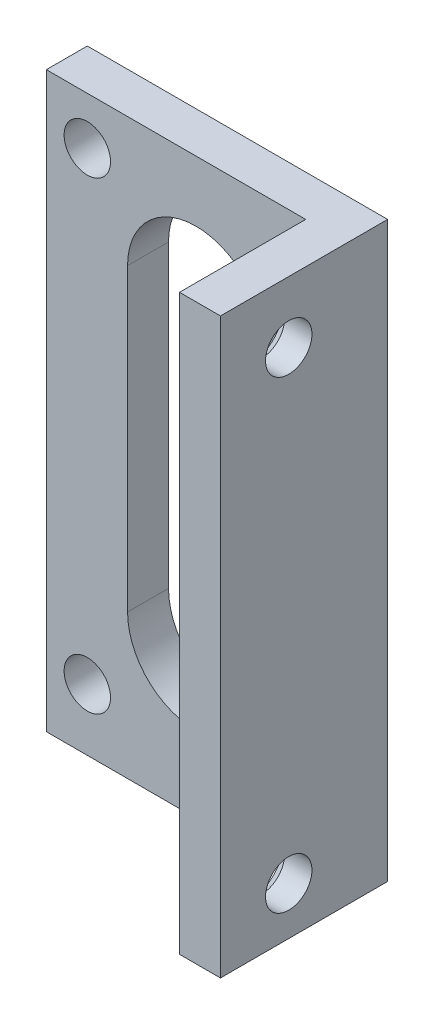
ISO-10303-21;
HEADER;
FILE_DESCRIPTION(('STEP AP214'),'2;1');
FILE_NAME('part.step','',(''),(''),'','','');
FILE_SCHEMA(('AUTOMOTIVE_DESIGN { 1 0 10303 214 1 1 1 1 }'));
ENDSEC;
DATA;
#1=APPLICATION_CONTEXT('core data for automotive mechanical design processes');
#2=APPLICATION_PROTOCOL_DEFINITION('international standard','automotive_design',2000,#1);
#3=PRODUCT_CONTEXT('',#1,'mechanical');
#4=PRODUCT('Part','Part','',(#3));
#5=PRODUCT_RELATED_PRODUCT_CATEGORY('part','',(#4));
#6=PRODUCT_DEFINITION_FORMATION('','',#4);
#7=PRODUCT_DEFINITION_CONTEXT('part definition',#1,'design');
#8=PRODUCT_DEFINITION('design','',#6,#7);
#9=PRODUCT_DEFINITION_SHAPE('','',#8);
#10=(LENGTH_UNIT() NAMED_UNIT(*) SI_UNIT(.MILLI.,.METRE.));
#11=(NAMED_UNIT(*) PLANE_ANGLE_UNIT() SI_UNIT($,.RADIAN.));
#12=(NAMED_UNIT(*) SI_UNIT($,.STERADIAN.) SOLID_ANGLE_UNIT());
#13=UNCERTAINTY_MEASURE_WITH_UNIT(LENGTH_MEASURE(1.E-05),#10,'distance_accuracy_value','');
#14=(GEOMETRIC_REPRESENTATION_CONTEXT(3) GLOBAL_UNCERTAINTY_ASSIGNED_CONTEXT((#13)) GLOBAL_UNIT_ASSIGNED_CONTEXT((#10,
#11,#12)) REPRESENTATION_CONTEXT('',''));
#15=CARTESIAN_POINT('',(0.,0.,0.));
#16=DIRECTION('',(0.,0.,1.));
#17=DIRECTION('',(1.,0.,0.));
#18=AXIS2_PLACEMENT_3D('',#15,#16,#17);
#19=CARTESIAN_POINT('',(0.,0.,0.));
#20=DIRECTION('',(1.,0.,0.));
#21=DIRECTION('',(0.,0.,-1.));
#22=AXIS2_PLACEMENT_3D('',#19,#20,#21);
#23=PLANE('',#22);
#24=CARTESIAN_POINT('',(0.,0.,0.));
#25=DIRECTION('',(1.,0.,0.));
#26=DIRECTION('',(0.,0.,-1.));
#27=AXIS2_PLACEMENT_3D('',#24,#25,#26);
#28=CIRCLE('',#27,2.70000000000001);
#29=CARTESIAN_POINT('',(0.,0.,-2.70000000000001));
#30=VERTEX_POINT('',#29);
#31=EDGE_CURVE('E213',#30,#30,#28,.T.);
#32=ORIENTED_EDGE('',*,*,#31,.T.);
#33=EDGE_LOOP('',(#32));
#34=FACE_BOUND('',#33,.T.);
#35=CARTESIAN_POINT('',(0.,34.,0.));
#36=DIRECTION('',(1.,0.,0.));
#37=DIRECTION('',(0.,0.,-1.));
#38=AXIS2_PLACEMENT_3D('',#35,#36,#37);
#39=CIRCLE('',#38,2.70000000000001);
#40=CARTESIAN_POINT('',(0.,34.,-2.70000000000001));
#41=VERTEX_POINT('',#40);
#42=EDGE_CURVE('E210',#41,#41,#39,.T.);
#43=ORIENTED_EDGE('',*,*,#42,.T.);
#44=EDGE_LOOP('',(#43));
#45=FACE_BOUND('',#44,.T.);
#46=DIRECTION('',(0.,1.,0.));
#47=VECTOR('',#46,1.);
#48=CARTESIAN_POINT('',(0.,38.5,-4.24665680886895));
#49=LINE('',#48,#47);
#50=CARTESIAN_POINT('',(0.,-3.5,-4.24665680886895));
#51=VERTEX_POINT('',#50);
#52=CARTESIAN_POINT('',(0.,38.5,-4.24665680886895));
#53=VERTEX_POINT('',#52);
#54=EDGE_CURVE('E159',#51,#53,#49,.T.);
#55=ORIENTED_EDGE('',*,*,#54,.F.);
#56=DIRECTION('',(0.,0.,-1.));
#57=VECTOR('',#56,1.);
#58=CARTESIAN_POINT('',(0.,-3.5,0.));
#59=LINE('',#58,#57);
#60=CARTESIAN_POINT('',(0.,-3.5,4.99999999999999));
#61=VERTEX_POINT('',#60);
#62=EDGE_CURVE('E178',#61,#51,#59,.T.);
#63=ORIENTED_EDGE('',*,*,#62,.F.);
#64=DIRECTION('',(0.,-1.,0.));
#65=VECTOR('',#64,1.);
#66=CARTESIAN_POINT('',(0.,0.,5.));
#67=LINE('',#66,#65);
#68=CARTESIAN_POINT('',(0.,38.5,5.));
#69=VERTEX_POINT('',#68);
#70=EDGE_CURVE('E183',#69,#61,#67,.T.);
#71=ORIENTED_EDGE('',*,*,#70,.F.);
#72=DIRECTION('',(0.,0.,1.));
#73=VECTOR('',#72,1.);
#74=CARTESIAN_POINT('',(0.,38.5,0.));
#75=LINE('',#74,#73);
#76=EDGE_CURVE('E198',#53,#69,#75,.T.);
#77=ORIENTED_EDGE('',*,*,#76,.F.);
#78=EDGE_LOOP('',(#55,#63,#71,#77));
#79=FACE_BOUND('',#78,.T.);
#80=ADVANCED_FACE('F35',(#34,#45,#79),#23,.F.);
#81=CARTESIAN_POINT('',(3.,-3.5,0.));
#82=DIRECTION('',(0.,1.,0.));
#83=DIRECTION('',(0.,0.,1.));
#84=AXIS2_PLACEMENT_3D('',#81,#82,#83);
#85=PLANE('',#84);
#86=ORIENTED_EDGE('',*,*,#62,.T.);
#87=DIRECTION('',(1.,0.,0.));
#88=VECTOR('',#87,1.);
#89=CARTESIAN_POINT('',(-19.,-3.5,-4.24665680886895));
#90=LINE('',#89,#88);
#91=CARTESIAN_POINT('',(-19.,-3.5,-4.24665680886895));
#92=VERTEX_POINT('',#91);
#93=EDGE_CURVE('E175',#92,#51,#90,.T.);
#94=ORIENTED_EDGE('',*,*,#93,.F.);
#95=DIRECTION('',(0.,0.,1.));
#96=VECTOR('',#95,1.);
#97=CARTESIAN_POINT('',(-19.,-3.5,-4.24665680886895));
#98=LINE('',#97,#96);
#99=CARTESIAN_POINT('',(-19.,-3.5,-7.24665680886895));
#100=VERTEX_POINT('',#99);
#101=EDGE_CURVE('E163',#100,#92,#98,.T.);
#102=ORIENTED_EDGE('',*,*,#101,.F.);
#103=DIRECTION('',(-1.,0.,0.));
#104=VECTOR('',#103,1.);
#105=CARTESIAN_POINT('',(3.,-3.5,-7.24665680886895));
#106=LINE('',#105,#104);
#107=CARTESIAN_POINT('',(3.,-3.5,-7.24665680886895));
#108=VERTEX_POINT('',#107);
#109=EDGE_CURVE('E208',#108,#100,#106,.T.);
#110=ORIENTED_EDGE('',*,*,#109,.F.);
#111=DIRECTION('',(0.,0.,-1.));
#112=VECTOR('',#111,1.);
#113=CARTESIAN_POINT('',(3.,-3.5,0.));
#114=LINE('',#113,#112);
#115=CARTESIAN_POINT('',(3.,-3.5,4.99999999999999));
#116=VERTEX_POINT('',#115);
#117=EDGE_CURVE('E182',#116,#108,#114,.T.);
#118=ORIENTED_EDGE('',*,*,#117,.F.);
#119=DIRECTION('',(-1.,0.,0.));
#120=VECTOR('',#119,1.);
#121=CARTESIAN_POINT('',(3.,-3.5,4.99999999999999));
#122=LINE('',#121,#120);
#123=EDGE_CURVE('E195',#116,#61,#122,.T.);
#124=ORIENTED_EDGE('',*,*,#123,.T.);
#125=EDGE_LOOP('',(#86,#94,#102,#110,#118,#124));
#126=FACE_BOUND('',#125,.T.);
#127=ADVANCED_FACE('F228',(#126),#85,.F.);
#128=CARTESIAN_POINT('',(3.,0.,-7.24665680886895));
#129=DIRECTION('',(0.,0.,-1.));
#130=DIRECTION('',(-1.,0.,0.));
#131=AXIS2_PLACEMENT_3D('',#128,#129,#130);
#132=PLANE('',#131);
#133=CARTESIAN_POINT('',(-8.04107401767495,29.0412137218457,-7.24665680886895));
#134=DIRECTION('',(0.,0.,-1.));
#135=DIRECTION('',(-1.,0.,0.));
#136=AXIS2_PLACEMENT_3D('',#133,#134,#135);
#137=CIRCLE('',#136,5.01011206358471);
#138=CARTESIAN_POINT('',(-13.0511860812597,29.0412137218457,-7.24665680886895));
#139=VERTEX_POINT('',#138);
#140=CARTESIAN_POINT('',(-3.03096195409024,29.0412137218457,-7.24665680886895));
#141=VERTEX_POINT('',#140);
#142=EDGE_CURVE('E145',#139,#141,#137,.T.);
#143=ORIENTED_EDGE('',*,*,#142,.F.);
#144=DIRECTION('',(0.,1.,0.));
#145=VECTOR('',#144,1.);
#146=CARTESIAN_POINT('',(-13.0511860812597,0.,-7.24665680886895));
#147=LINE('',#146,#145);
#148=CARTESIAN_POINT('',(-13.0511860812597,7.06663976611031,-7.24665680886895));
#149=VERTEX_POINT('',#148);
#150=EDGE_CURVE('E138',#149,#139,#147,.T.);
#151=ORIENTED_EDGE('',*,*,#150,.F.);
#152=CARTESIAN_POINT('',(-8.04107401767495,7.06663976611031,-7.24665680886895));
#153=DIRECTION('',(0.,0.,-1.));
#154=DIRECTION('',(-1.,0.,0.));
#155=AXIS2_PLACEMENT_3D('',#152,#153,#154);
#156=CIRCLE('',#155,5.01011206358471);
#157=CARTESIAN_POINT('',(-3.03096195409024,7.06663976611031,-7.24665680886895));
#158=VERTEX_POINT('',#157);
#159=EDGE_CURVE('E118',#158,#149,#156,.T.);
#160=ORIENTED_EDGE('',*,*,#159,.F.);
#161=DIRECTION('',(0.,-1.,0.));
#162=VECTOR('',#161,1.);
#163=CARTESIAN_POINT('',(-3.03096195409024,0.,-7.24665680886895));
#164=LINE('',#163,#162);
#165=EDGE_CURVE('E143',#141,#158,#164,.T.);
#166=ORIENTED_EDGE('',*,*,#165,.F.);
#167=EDGE_LOOP('',(#143,#151,#160,#166));
#168=FACE_BOUND('',#167,.T.);
#169=CARTESIAN_POINT('',(-16.,35.0103787056936,-7.24665680886895));
#170=DIRECTION('',(0.,0.,-1.));
#171=DIRECTION('',(-1.,0.,0.));
#172=AXIS2_PLACEMENT_3D('',#169,#170,#171);
#173=CIRCLE('',#172,1.7);
#174=CARTESIAN_POINT('',(-17.7,35.0103787056936,-7.24665680886895));
#175=VERTEX_POINT('',#174);
#176=EDGE_CURVE('E150',#175,#175,#173,.T.);
#177=ORIENTED_EDGE('',*,*,#176,.F.);
#178=EDGE_LOOP('',(#177));
#179=FACE_BOUND('',#178,.T.);
#180=CARTESIAN_POINT('',(-16.,1.0103787056936,-7.24665680886895));
#181=DIRECTION('',(0.,0.,-1.));
#182=DIRECTION('',(-1.,0.,0.));
#183=AXIS2_PLACEMENT_3D('',#180,#181,#182);
#184=CIRCLE('',#183,1.7);
#185=CARTESIAN_POINT('',(-17.7,1.0103787056936,-7.24665680886895));
#186=VERTEX_POINT('',#185);
#187=EDGE_CURVE('E156',#186,#186,#184,.T.);
#188=ORIENTED_EDGE('',*,*,#187,.F.);
#189=EDGE_LOOP('',(#188));
#190=FACE_BOUND('',#189,.T.);
#191=ORIENTED_EDGE('',*,*,#109,.T.);
#192=DIRECTION('',(0.,-1.,0.));
#193=VECTOR('',#192,1.);
#194=CARTESIAN_POINT('',(-19.,-3.5,-7.24665680886895));
#195=LINE('',#194,#193);
#196=CARTESIAN_POINT('',(-19.,38.5,-7.24665680886895));
#197=VERTEX_POINT('',#196);
#198=EDGE_CURVE('E160',#197,#100,#195,.T.);
#199=ORIENTED_EDGE('',*,*,#198,.F.);
#200=DIRECTION('',(-1.,0.,0.));
#201=VECTOR('',#200,1.);
#202=CARTESIAN_POINT('',(3.,38.5,-7.24665680886895));
#203=LINE('',#202,#201);
#204=CARTESIAN_POINT('',(3.,38.5,-7.24665680886895));
#205=VERTEX_POINT('',#204);
#206=EDGE_CURVE('E206',#205,#197,#203,.T.);
#207=ORIENTED_EDGE('',*,*,#206,.F.);
#208=DIRECTION('',(0.,-1.,0.));
#209=VECTOR('',#208,1.);
#210=CARTESIAN_POINT('',(3.,0.,-7.24665680886895));
#211=LINE('',#210,#209);
#212=EDGE_CURVE('E185',#205,#108,#211,.T.);
#213=ORIENTED_EDGE('',*,*,#212,.T.);
#214=EDGE_LOOP('',(#191,#199,#207,#213));
#215=FACE_BOUND('',#214,.T.);
#216=ADVANCED_FACE('F249',(#168,#179,#190,#215),#132,.T.);
#217=CARTESIAN_POINT('',(3.,38.5,0.));
#218=DIRECTION('',(0.,-1.,0.));
#219=DIRECTION('',(0.,0.,-1.));
#220=AXIS2_PLACEMENT_3D('',#217,#218,#219);
#221=PLANE('',#220);
#222=ORIENTED_EDGE('',*,*,#206,.T.);
#223=DIRECTION('',(0.,0.,-1.));
#224=VECTOR('',#223,1.);
#225=CARTESIAN_POINT('',(-19.,38.5,-7.24665680886895));
#226=LINE('',#225,#224);
#227=CARTESIAN_POINT('',(-19.,38.5,-4.24665680886895));
#228=VERTEX_POINT('',#227);
#229=EDGE_CURVE('E167',#228,#197,#226,.T.);
#230=ORIENTED_EDGE('',*,*,#229,.F.);
#231=DIRECTION('',(1.,0.,0.));
#232=VECTOR('',#231,1.);
#233=CARTESIAN_POINT('',(-19.,38.5,-4.24665680886895));
#234=LINE('',#233,#232);
#235=EDGE_CURVE('E170',#228,#53,#234,.T.);
#236=ORIENTED_EDGE('',*,*,#235,.T.);
#237=ORIENTED_EDGE('',*,*,#76,.T.);
#238=DIRECTION('',(-1.,0.,0.));
#239=VECTOR('',#238,1.);
#240=CARTESIAN_POINT('',(3.,38.5,5.));
#241=LINE('',#240,#239);
#242=CARTESIAN_POINT('',(3.,38.5,5.));
#243=VERTEX_POINT('',#242);
#244=EDGE_CURVE('E203',#243,#69,#241,.T.);
#245=ORIENTED_EDGE('',*,*,#244,.F.);
#246=DIRECTION('',(0.,0.,1.));
#247=VECTOR('',#246,1.);
#248=CARTESIAN_POINT('',(3.,38.5,0.));
#249=LINE('',#248,#247);
#250=EDGE_CURVE('E188',#205,#243,#249,.T.);
#251=ORIENTED_EDGE('',*,*,#250,.F.);
#252=EDGE_LOOP('',(#222,#230,#236,#237,#245,#251));
#253=FACE_BOUND('',#252,.T.);
#254=ADVANCED_FACE('F259',(#253),#221,.F.);
#255=CARTESIAN_POINT('',(3.,0.,5.));
#256=DIRECTION('',(0.,0.,-1.));
#257=DIRECTION('',(0.,1.,0.));
#258=AXIS2_PLACEMENT_3D('',#255,#256,#257);
#259=PLANE('',#258);
#260=ORIENTED_EDGE('',*,*,#70,.T.);
#261=ORIENTED_EDGE('',*,*,#123,.F.);
#262=DIRECTION('',(0.,-1.,0.));
#263=VECTOR('',#262,1.);
#264=CARTESIAN_POINT('',(3.,0.,5.));
#265=LINE('',#264,#263);
#266=EDGE_CURVE('E190',#243,#116,#265,.T.);
#267=ORIENTED_EDGE('',*,*,#266,.F.);
#268=ORIENTED_EDGE('',*,*,#244,.T.);
#269=EDGE_LOOP('',(#260,#261,#267,#268));
#270=FACE_BOUND('',#269,.T.);
#271=ADVANCED_FACE('F257',(#270),#259,.F.);
#272=CARTESIAN_POINT('',(3.,34.,0.));
#273=DIRECTION('',(-1.,0.,0.));
#274=DIRECTION('',(0.,0.,1.));
#275=AXIS2_PLACEMENT_3D('',#272,#273,#274);
#276=CYLINDRICAL_SURFACE('',#275,1.7);
#277=CARTESIAN_POINT('',(1.00000000000002,34.,0.));
#278=DIRECTION('',(1.,0.,0.));
#279=DIRECTION('',(0.,0.,-1.));
#280=AXIS2_PLACEMENT_3D('',#277,#278,#279);
#281=CIRCLE('',#280,1.7);
#282=CARTESIAN_POINT('',(1.00000000000002,34.,-1.7));
#283=VERTEX_POINT('',#282);
#284=EDGE_CURVE('E11',#283,#283,#281,.F.);
#285=ORIENTED_EDGE('',*,*,#284,.T.);
#286=EDGE_LOOP('',(#285));
#287=FACE_BOUND('',#286,.T.);
#288=CARTESIAN_POINT('',(3.,34.,0.));
#289=DIRECTION('',(1.,0.,0.));
#290=DIRECTION('',(0.,0.,-1.));
#291=AXIS2_PLACEMENT_3D('',#288,#289,#290);
#292=CIRCLE('',#291,1.7);
#293=CARTESIAN_POINT('',(3.,34.,-1.7));
#294=VERTEX_POINT('',#293);
#295=EDGE_CURVE('E179',#294,#294,#292,.T.);
#296=ORIENTED_EDGE('',*,*,#295,.T.);
#297=EDGE_LOOP('',(#296));
#298=FACE_BOUND('',#297,.T.);
#299=ADVANCED_FACE('F266',(#287,#298),#276,.F.);
#300=CARTESIAN_POINT('',(3.,0.,0.));
#301=DIRECTION('',(-1.,0.,0.));
#302=DIRECTION('',(0.,0.,1.));
#303=AXIS2_PLACEMENT_3D('',#300,#301,#302);
#304=CYLINDRICAL_SURFACE('',#303,1.7);
#305=CARTESIAN_POINT('',(1.00000000000002,0.,0.));
#306=DIRECTION('',(1.,0.,0.));
#307=DIRECTION('',(0.,0.,-1.));
#308=AXIS2_PLACEMENT_3D('',#305,#306,#307);
#309=CIRCLE('',#308,1.7);
#310=CARTESIAN_POINT('',(1.00000000000002,0.,-1.7));
#311=VERTEX_POINT('',#310);
#312=EDGE_CURVE('E43',#311,#311,#309,.F.);
#313=ORIENTED_EDGE('',*,*,#312,.T.);
#314=EDGE_LOOP('',(#313));
#315=FACE_BOUND('',#314,.T.);
#316=CARTESIAN_POINT('',(3.,0.,0.));
#317=DIRECTION('',(1.,0.,0.));
#318=DIRECTION('',(0.,0.,-1.));
#319=AXIS2_PLACEMENT_3D('',#316,#317,#318);
#320=CIRCLE('',#319,1.7);
#321=CARTESIAN_POINT('',(3.,0.,-1.7));
#322=VERTEX_POINT('',#321);
#323=EDGE_CURVE('E192',#322,#322,#320,.T.);
#324=ORIENTED_EDGE('',*,*,#323,.T.);
#325=EDGE_LOOP('',(#324));
#326=FACE_BOUND('',#325,.T.);
#327=ADVANCED_FACE('F218',(#315,#326),#304,.F.);
#328=CARTESIAN_POINT('',(3.,0.,0.));
#329=DIRECTION('',(1.,0.,0.));
#330=DIRECTION('',(0.,0.,-1.));
#331=AXIS2_PLACEMENT_3D('',#328,#329,#330);
#332=PLANE('',#331);
#333=ORIENTED_EDGE('',*,*,#295,.F.);
#334=EDGE_LOOP('',(#333));
#335=FACE_BOUND('',#334,.T.);
#336=ORIENTED_EDGE('',*,*,#117,.T.);
#337=ORIENTED_EDGE('',*,*,#212,.F.);
#338=ORIENTED_EDGE('',*,*,#250,.T.);
#339=ORIENTED_EDGE('',*,*,#266,.T.);
#340=EDGE_LOOP('',(#336,#337,#338,#339));
#341=FACE_BOUND('',#340,.T.);
#342=ORIENTED_EDGE('',*,*,#323,.F.);
#343=EDGE_LOOP('',(#342));
#344=FACE_BOUND('',#343,.T.);
#345=ADVANCED_FACE('F252',(#335,#341,#344),#332,.T.);
#346=CARTESIAN_POINT('',(-19.,38.5,-4.24665680886895));
#347=DIRECTION('',(0.,0.,-1.));
#348=DIRECTION('',(-1.,0.,0.));
#349=AXIS2_PLACEMENT_3D('',#346,#347,#348);
#350=PLANE('',#349);
#351=DIRECTION('',(0.,-1.,0.));
#352=VECTOR('',#351,1.);
#353=CARTESIAN_POINT('',(-13.0511860812597,29.0412137218457,-4.24665680886895));
#354=LINE('',#353,#352);
#355=CARTESIAN_POINT('',(-13.0511860812597,29.0412137218457,-4.24665680886895));
#356=VERTEX_POINT('',#355);
#357=CARTESIAN_POINT('',(-13.0511860812597,7.06663976611031,-4.24665680886895));
#358=VERTEX_POINT('',#357);
#359=EDGE_CURVE('E124',#356,#358,#354,.T.);
#360=ORIENTED_EDGE('',*,*,#359,.F.);
#361=CARTESIAN_POINT('',(-8.04107401767495,29.0412137218457,-4.24665680886895));
#362=DIRECTION('',(0.,0.,1.));
#363=DIRECTION('',(1.,0.,0.));
#364=AXIS2_PLACEMENT_3D('',#361,#362,#363);
#365=CIRCLE('',#364,5.01011206358471);
#366=CARTESIAN_POINT('',(-3.03096195409024,29.0412137218457,-4.24665680886895));
#367=VERTEX_POINT('',#366);
#368=EDGE_CURVE('E58',#367,#356,#365,.T.);
#369=ORIENTED_EDGE('',*,*,#368,.F.);
#370=DIRECTION('',(0.,1.,0.));
#371=VECTOR('',#370,1.);
#372=CARTESIAN_POINT('',(-3.03096195409024,29.0412137218457,-4.24665680886895));
#373=LINE('',#372,#371);
#374=CARTESIAN_POINT('',(-3.03096195409024,7.06663976611031,-4.24665680886895));
#375=VERTEX_POINT('',#374);
#376=EDGE_CURVE('E131',#375,#367,#373,.T.);
#377=ORIENTED_EDGE('',*,*,#376,.F.);
#378=CARTESIAN_POINT('',(-8.04107401767495,7.06663976611031,-4.24665680886895));
#379=DIRECTION('',(0.,0.,1.));
#380=DIRECTION('',(1.,0.,0.));
#381=AXIS2_PLACEMENT_3D('',#378,#379,#380);
#382=CIRCLE('',#381,5.01011206358471);
#383=EDGE_CURVE('E115',#358,#375,#382,.T.);
#384=ORIENTED_EDGE('',*,*,#383,.F.);
#385=EDGE_LOOP('',(#360,#369,#377,#384));
#386=FACE_BOUND('',#385,.T.);
#387=CARTESIAN_POINT('',(-16.,35.0103787056936,-4.24665680886895));
#388=DIRECTION('',(0.,0.,1.));
#389=DIRECTION('',(1.,0.,0.));
#390=AXIS2_PLACEMENT_3D('',#387,#388,#389);
#391=CIRCLE('',#390,1.7);
#392=CARTESIAN_POINT('',(-14.3,35.0103787056936,-4.24665680886895));
#393=VERTEX_POINT('',#392);
#394=EDGE_CURVE('E147',#393,#393,#391,.T.);
#395=ORIENTED_EDGE('',*,*,#394,.F.);
#396=EDGE_LOOP('',(#395));
#397=FACE_BOUND('',#396,.T.);
#398=CARTESIAN_POINT('',(-16.,1.0103787056936,-4.24665680886895));
#399=DIRECTION('',(0.,0.,1.));
#400=DIRECTION('',(1.,0.,0.));
#401=AXIS2_PLACEMENT_3D('',#398,#399,#400);
#402=CIRCLE('',#401,1.7);
#403=CARTESIAN_POINT('',(-14.3,1.0103787056936,-4.24665680886895));
#404=VERTEX_POINT('',#403);
#405=EDGE_CURVE('E153',#404,#404,#402,.T.);
#406=ORIENTED_EDGE('',*,*,#405,.F.);
#407=EDGE_LOOP('',(#406));
#408=FACE_BOUND('',#407,.T.);
#409=ORIENTED_EDGE('',*,*,#54,.T.);
#410=ORIENTED_EDGE('',*,*,#235,.F.);
#411=DIRECTION('',(0.,1.,0.));
#412=VECTOR('',#411,1.);
#413=CARTESIAN_POINT('',(-19.,38.5,-4.24665680886895));
#414=LINE('',#413,#412);
#415=EDGE_CURVE('E165',#92,#228,#414,.T.);
#416=ORIENTED_EDGE('',*,*,#415,.F.);
#417=ORIENTED_EDGE('',*,*,#93,.T.);
#418=EDGE_LOOP('',(#409,#410,#416,#417));
#419=FACE_BOUND('',#418,.T.);
#420=ADVANCED_FACE('F128',(#386,#397,#408,#419),#350,.F.);
#421=CARTESIAN_POINT('',(-19.,0.,0.));
#422=DIRECTION('',(1.,0.,0.));
#423=DIRECTION('',(0.,0.,-1.));
#424=AXIS2_PLACEMENT_3D('',#421,#422,#423);
#425=PLANE('',#424);
#426=ORIENTED_EDGE('',*,*,#198,.T.);
#427=ORIENTED_EDGE('',*,*,#101,.T.);
#428=ORIENTED_EDGE('',*,*,#415,.T.);
#429=ORIENTED_EDGE('',*,*,#229,.T.);
#430=EDGE_LOOP('',(#426,#427,#428,#429));
#431=FACE_BOUND('',#430,.T.);
#432=ADVANCED_FACE('F244',(#431),#425,.F.);
#433=CARTESIAN_POINT('',(-16.,1.0103787056936,-9.24665680886895));
#434=DIRECTION('',(0.,0.,1.));
#435=DIRECTION('',(1.,0.,0.));
#436=AXIS2_PLACEMENT_3D('',#433,#434,#435);
#437=CYLINDRICAL_SURFACE('',#436,1.7);
#438=ORIENTED_EDGE('',*,*,#187,.T.);
#439=EDGE_LOOP('',(#438));
#440=FACE_BOUND('',#439,.T.);
#441=ORIENTED_EDGE('',*,*,#405,.T.);
#442=EDGE_LOOP('',(#441));
#443=FACE_BOUND('',#442,.T.);
#444=ADVANCED_FACE('F292',(#440,#443),#437,.F.);
#445=CARTESIAN_POINT('',(-16.,35.0103787056936,-9.24665680886895));
#446=DIRECTION('',(0.,0.,1.));
#447=DIRECTION('',(1.,0.,0.));
#448=AXIS2_PLACEMENT_3D('',#445,#446,#447);
#449=CYLINDRICAL_SURFACE('',#448,1.7);
#450=ORIENTED_EDGE('',*,*,#176,.T.);
#451=EDGE_LOOP('',(#450));
#452=FACE_BOUND('',#451,.T.);
#453=ORIENTED_EDGE('',*,*,#394,.T.);
#454=EDGE_LOOP('',(#453));
#455=FACE_BOUND('',#454,.T.);
#456=ADVANCED_FACE('F295',(#452,#455),#449,.F.);
#457=CARTESIAN_POINT('',(-8.04107401767495,29.0412137218457,-9.24665680886895));
#458=DIRECTION('',(0.,0.,1.));
#459=DIRECTION('',(1.,0.,0.));
#460=AXIS2_PLACEMENT_3D('',#457,#458,#459);
#461=CYLINDRICAL_SURFACE('',#460,5.01011206358471);
#462=ORIENTED_EDGE('',*,*,#142,.T.);
#463=DIRECTION('',(0.,0.,1.));
#464=VECTOR('',#463,1.);
#465=CARTESIAN_POINT('',(-3.03096195409024,29.0412137218457,-9.24665680886895));
#466=LINE('',#465,#464);
#467=EDGE_CURVE('E136',#141,#367,#466,.T.);
#468=ORIENTED_EDGE('',*,*,#467,.T.);
#469=ORIENTED_EDGE('',*,*,#368,.T.);
#470=DIRECTION('',(0.,0.,1.));
#471=VECTOR('',#470,1.);
#472=CARTESIAN_POINT('',(-13.0511860812597,29.0412137218457,-9.24665680886895));
#473=LINE('',#472,#471);
#474=EDGE_CURVE('E121',#139,#356,#473,.T.);
#475=ORIENTED_EDGE('',*,*,#474,.F.);
#476=EDGE_LOOP('',(#462,#468,#469,#475));
#477=FACE_BOUND('',#476,.T.);
#478=ADVANCED_FACE('F299',(#477),#461,.F.);
#479=CARTESIAN_POINT('',(-3.03096195409024,29.0412137218457,-9.24665680886895));
#480=DIRECTION('',(1.,0.,0.));
#481=DIRECTION('',(0.,1.,0.));
#482=AXIS2_PLACEMENT_3D('',#479,#480,#481);
#483=PLANE('',#482);
#484=ORIENTED_EDGE('',*,*,#165,.T.);
#485=DIRECTION('',(0.,0.,1.));
#486=VECTOR('',#485,1.);
#487=CARTESIAN_POINT('',(-3.03096195409024,7.06663976611031,-9.24665680886895));
#488=LINE('',#487,#486);
#489=EDGE_CURVE('E120',#158,#375,#488,.T.);
#490=ORIENTED_EDGE('',*,*,#489,.T.);
#491=ORIENTED_EDGE('',*,*,#376,.T.);
#492=ORIENTED_EDGE('',*,*,#467,.F.);
#493=EDGE_LOOP('',(#484,#490,#491,#492));
#494=FACE_BOUND('',#493,.T.);
#495=ADVANCED_FACE('F303',(#494),#483,.F.);
#496=CARTESIAN_POINT('',(-8.04107401767495,7.06663976611031,-9.24665680886895));
#497=DIRECTION('',(0.,0.,1.));
#498=DIRECTION('',(1.,0.,0.));
#499=AXIS2_PLACEMENT_3D('',#496,#497,#498);
#500=CYLINDRICAL_SURFACE('',#499,5.01011206358471);
#501=ORIENTED_EDGE('',*,*,#159,.T.);
#502=DIRECTION('',(0.,0.,1.));
#503=VECTOR('',#502,1.);
#504=CARTESIAN_POINT('',(-13.0511860812597,7.06663976611031,-9.24665680886895));
#505=LINE('',#504,#503);
#506=EDGE_CURVE('E50',#149,#358,#505,.T.);
#507=ORIENTED_EDGE('',*,*,#506,.T.);
#508=ORIENTED_EDGE('',*,*,#383,.T.);
#509=ORIENTED_EDGE('',*,*,#489,.F.);
#510=EDGE_LOOP('',(#501,#507,#508,#509));
#511=FACE_BOUND('',#510,.T.);
#512=ADVANCED_FACE('F112',(#511),#500,.F.);
#513=CARTESIAN_POINT('',(-13.0511860812597,29.0412137218457,-9.24665680886895));
#514=DIRECTION('',(-1.,0.,0.));
#515=DIRECTION('',(0.,-1.,0.));
#516=AXIS2_PLACEMENT_3D('',#513,#514,#515);
#517=PLANE('',#516);
#518=ORIENTED_EDGE('',*,*,#150,.T.);
#519=ORIENTED_EDGE('',*,*,#474,.T.);
#520=ORIENTED_EDGE('',*,*,#359,.T.);
#521=ORIENTED_EDGE('',*,*,#506,.F.);
#522=EDGE_LOOP('',(#518,#519,#520,#521));
#523=FACE_BOUND('',#522,.T.);
#524=ADVANCED_FACE('F125',(#523),#517,.F.);
#525=CARTESIAN_POINT('',(0.,0.,0.));
#526=DIRECTION('',(-1.,0.,0.));
#527=DIRECTION('',(0.,0.,1.));
#528=AXIS2_PLACEMENT_3D('',#525,#526,#527);
#529=CONICAL_SURFACE('',#528,2.70000000000001,0.785398163397444);
#530=ORIENTED_EDGE('',*,*,#312,.F.);
#531=EDGE_LOOP('',(#530));
#532=FACE_BOUND('',#531,.T.);
#533=ORIENTED_EDGE('',*,*,#31,.F.);
#534=EDGE_LOOP('',(#533));
#535=FACE_BOUND('',#534,.T.);
#536=ADVANCED_FACE('F221',(#532,#535),#529,.F.);
#537=CARTESIAN_POINT('',(0.,34.,0.));
#538=DIRECTION('',(-1.,0.,0.));
#539=DIRECTION('',(0.,0.,1.));
#540=AXIS2_PLACEMENT_3D('',#537,#538,#539);
#541=CONICAL_SURFACE('',#540,2.70000000000001,0.785398163397444);
#542=ORIENTED_EDGE('',*,*,#284,.F.);
#543=EDGE_LOOP('',(#542));
#544=FACE_BOUND('',#543,.T.);
#545=ORIENTED_EDGE('',*,*,#42,.F.);
#546=EDGE_LOOP('',(#545));
#547=FACE_BOUND('',#546,.T.);
#548=ADVANCED_FACE('F37',(#544,#547),#541,.F.);
#549=CLOSED_SHELL('',(#80,#127,#216,#254,#271,#299,#327,#345,#420,#432,#444,#456,#478,#495,#512,
#524,#536,#548));
#550=MANIFOLD_SOLID_BREP('B2',#549);
#551=ADVANCED_BREP_SHAPE_REPRESENTATION('',(#18,#550),#14);
#552=SHAPE_DEFINITION_REPRESENTATION(#9,#551);
ENDSEC;
END-ISO-10303-21;
